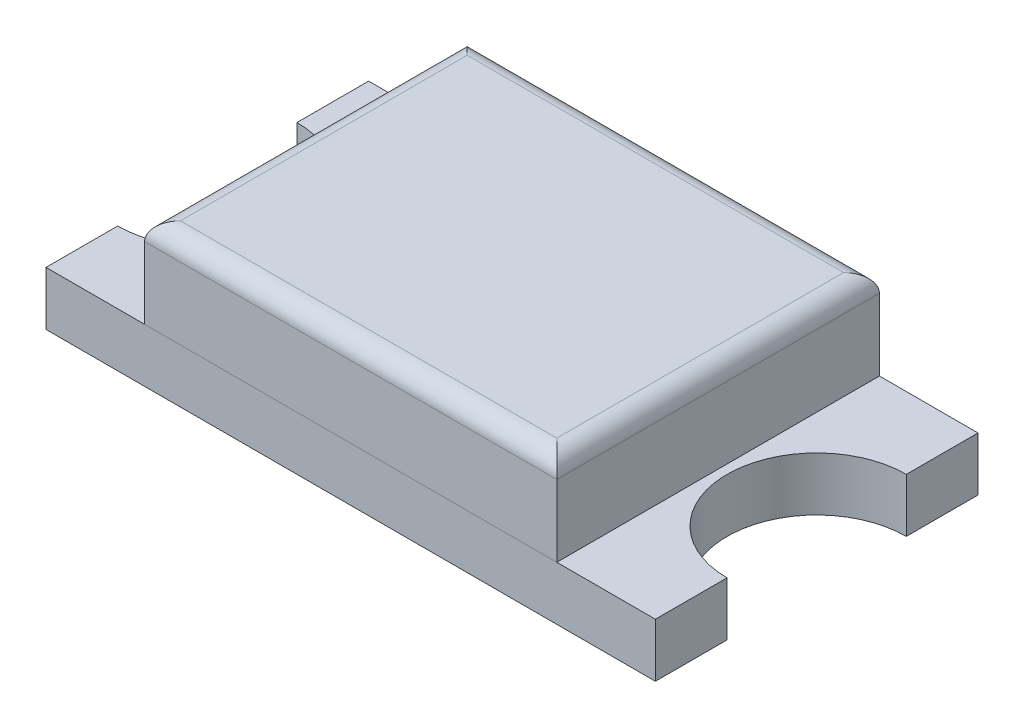
ISO-10303-21;
HEADER;
FILE_DESCRIPTION(('STEP AP214'),'2;1');
FILE_NAME('part.step','',(''),(''),'','','');
FILE_SCHEMA(('AUTOMOTIVE_DESIGN { 1 0 10303 214 1 1 1 1 }'));
ENDSEC;
DATA;
#1=APPLICATION_CONTEXT('core data for automotive mechanical design processes');
#2=APPLICATION_PROTOCOL_DEFINITION('international standard','automotive_design',2000,#1);
#3=PRODUCT_CONTEXT('',#1,'mechanical');
#4=PRODUCT('Part','Part','',(#3));
#5=PRODUCT_RELATED_PRODUCT_CATEGORY('part','',(#4));
#6=PRODUCT_DEFINITION_FORMATION('','',#4);
#7=PRODUCT_DEFINITION_CONTEXT('part definition',#1,'design');
#8=PRODUCT_DEFINITION('design','',#6,#7);
#9=PRODUCT_DEFINITION_SHAPE('','',#8);
#10=(LENGTH_UNIT() NAMED_UNIT(*) SI_UNIT(.MILLI.,.METRE.));
#11=(NAMED_UNIT(*) PLANE_ANGLE_UNIT() SI_UNIT($,.RADIAN.));
#12=(NAMED_UNIT(*) SI_UNIT($,.STERADIAN.) SOLID_ANGLE_UNIT());
#13=UNCERTAINTY_MEASURE_WITH_UNIT(LENGTH_MEASURE(1.E-05),#10,'distance_accuracy_value','');
#14=(GEOMETRIC_REPRESENTATION_CONTEXT(3) GLOBAL_UNCERTAINTY_ASSIGNED_CONTEXT((#13)) GLOBAL_UNIT_ASSIGNED_CONTEXT((#10,
#11,#12)) REPRESENTATION_CONTEXT('',''));
#15=CARTESIAN_POINT('',(0.,0.,0.));
#16=DIRECTION('',(0.,0.,1.));
#17=DIRECTION('',(1.,0.,0.));
#18=AXIS2_PLACEMENT_3D('',#15,#16,#17);
#19=CARTESIAN_POINT('',(-0.575,0.4,0.45));
#20=DIRECTION('',(1.,0.,0.));
#21=DIRECTION('',(0.,0.,-1.));
#22=AXIS2_PLACEMENT_3D('',#19,#20,#21);
#23=PLANE('',#22);
#24=DIRECTION('',(0.,-1.,0.));
#25=VECTOR('',#24,1.);
#26=CARTESIAN_POINT('',(-0.575,0.4,0.45));
#27=LINE('',#26,#25);
#28=CARTESIAN_POINT('',(-0.575,0.35,0.45));
#29=VERTEX_POINT('',#28);
#30=CARTESIAN_POINT('',(-0.575,0.15,0.45));
#31=VERTEX_POINT('',#30);
#32=EDGE_CURVE('E94',#29,#31,#27,.T.);
#33=ORIENTED_EDGE('',*,*,#32,.F.);
#34=DIRECTION('',(0.,0.,1.));
#35=VECTOR('',#34,1.);
#36=CARTESIAN_POINT('',(-0.575,0.35,0.45));
#37=LINE('',#36,#35);
#38=CARTESIAN_POINT('',(-0.575,0.35,-0.45));
#39=VERTEX_POINT('',#38);
#40=EDGE_CURVE('E51',#29,#39,#37,.F.);
#41=ORIENTED_EDGE('',*,*,#40,.T.);
#42=DIRECTION('',(0.,-1.,0.));
#43=VECTOR('',#42,1.);
#44=CARTESIAN_POINT('',(-0.575,0.4,-0.45));
#45=LINE('',#44,#43);
#46=CARTESIAN_POINT('',(-0.575,0.15,-0.45));
#47=VERTEX_POINT('',#46);
#48=EDGE_CURVE('E114',#39,#47,#45,.T.);
#49=ORIENTED_EDGE('',*,*,#48,.T.);
#50=DIRECTION('',(0.,0.,1.));
#51=VECTOR('',#50,1.);
#52=CARTESIAN_POINT('',(-0.575,0.15,0.45));
#53=LINE('',#52,#51);
#54=EDGE_CURVE('E109',#47,#31,#53,.T.);
#55=ORIENTED_EDGE('',*,*,#54,.T.);
#56=EDGE_LOOP('',(#33,#41,#49,#55));
#57=FACE_BOUND('',#56,.T.);
#58=ADVANCED_FACE('F42',(#57),#23,.F.);
#59=CARTESIAN_POINT('',(-0.575,0.4,0.45));
#60=DIRECTION('',(0.,0.,-1.));
#61=DIRECTION('',(-1.,0.,0.));
#62=AXIS2_PLACEMENT_3D('',#59,#60,#61);
#63=PLANE('',#62);
#64=DIRECTION('',(0.,-1.,0.));
#65=VECTOR('',#64,1.);
#66=CARTESIAN_POINT('',(0.575,0.4,0.45));
#67=LINE('',#66,#65);
#68=CARTESIAN_POINT('',(0.575,0.35,0.45));
#69=VERTEX_POINT('',#68);
#70=CARTESIAN_POINT('',(0.575,0.15,0.45));
#71=VERTEX_POINT('',#70);
#72=EDGE_CURVE('E103',#69,#71,#67,.T.);
#73=ORIENTED_EDGE('',*,*,#72,.F.);
#74=DIRECTION('',(1.,0.,0.));
#75=VECTOR('',#74,1.);
#76=CARTESIAN_POINT('',(-0.575,0.35,0.45));
#77=LINE('',#76,#75);
#78=EDGE_CURVE('E12',#69,#29,#77,.F.);
#79=ORIENTED_EDGE('',*,*,#78,.T.);
#80=ORIENTED_EDGE('',*,*,#32,.T.);
#81=DIRECTION('',(1.,0.,0.));
#82=VECTOR('',#81,1.);
#83=CARTESIAN_POINT('',(-0.575,0.15,0.45));
#84=LINE('',#83,#82);
#85=EDGE_CURVE('E97',#31,#71,#84,.T.);
#86=ORIENTED_EDGE('',*,*,#85,.T.);
#87=EDGE_LOOP('',(#73,#79,#80,#86));
#88=FACE_BOUND('',#87,.T.);
#89=ADVANCED_FACE('F96',(#88),#63,.F.);
#90=CARTESIAN_POINT('',(0.575,0.4,0.45));
#91=DIRECTION('',(-1.,0.,0.));
#92=DIRECTION('',(0.,0.,1.));
#93=AXIS2_PLACEMENT_3D('',#90,#91,#92);
#94=PLANE('',#93);
#95=DIRECTION('',(0.,-1.,0.));
#96=VECTOR('',#95,1.);
#97=CARTESIAN_POINT('',(0.575,0.4,-0.45));
#98=LINE('',#97,#96);
#99=CARTESIAN_POINT('',(0.575,0.35,-0.45));
#100=VERTEX_POINT('',#99);
#101=CARTESIAN_POINT('',(0.575,0.15,-0.45));
#102=VERTEX_POINT('',#101);
#103=EDGE_CURVE('E124',#100,#102,#98,.T.);
#104=ORIENTED_EDGE('',*,*,#103,.F.);
#105=DIRECTION('',(0.,0.,-1.));
#106=VECTOR('',#105,1.);
#107=CARTESIAN_POINT('',(0.575,0.35,0.45));
#108=LINE('',#107,#106);
#109=EDGE_CURVE('E65',#100,#69,#108,.F.);
#110=ORIENTED_EDGE('',*,*,#109,.T.);
#111=ORIENTED_EDGE('',*,*,#72,.T.);
#112=DIRECTION('',(0.,0.,-1.));
#113=VECTOR('',#112,1.);
#114=CARTESIAN_POINT('',(0.575,0.15,0.45));
#115=LINE('',#114,#113);
#116=EDGE_CURVE('E111',#71,#102,#115,.T.);
#117=ORIENTED_EDGE('',*,*,#116,.T.);
#118=EDGE_LOOP('',(#104,#110,#111,#117));
#119=FACE_BOUND('',#118,.T.);
#120=ADVANCED_FACE('F162',(#119),#94,.F.);
#121=CARTESIAN_POINT('',(-0.575,0.4,-0.45));
#122=DIRECTION('',(0.,0.,1.));
#123=DIRECTION('',(1.,0.,0.));
#124=AXIS2_PLACEMENT_3D('',#121,#122,#123);
#125=PLANE('',#124);
#126=ORIENTED_EDGE('',*,*,#48,.F.);
#127=DIRECTION('',(-1.,0.,0.));
#128=VECTOR('',#127,1.);
#129=CARTESIAN_POINT('',(-0.575,0.35,-0.45));
#130=LINE('',#129,#128);
#131=EDGE_CURVE('E135',#39,#100,#130,.F.);
#132=ORIENTED_EDGE('',*,*,#131,.T.);
#133=ORIENTED_EDGE('',*,*,#103,.T.);
#134=DIRECTION('',(-1.,0.,0.));
#135=VECTOR('',#134,1.);
#136=CARTESIAN_POINT('',(-0.575,0.15,-0.45));
#137=LINE('',#136,#135);
#138=EDGE_CURVE('E121',#102,#47,#137,.T.);
#139=ORIENTED_EDGE('',*,*,#138,.T.);
#140=EDGE_LOOP('',(#126,#132,#133,#139));
#141=FACE_BOUND('',#140,.T.);
#142=ADVANCED_FACE('F161',(#141),#125,.F.);
#143=CARTESIAN_POINT('',(-0.575,0.4,-0.45));
#144=DIRECTION('',(0.,-1.,0.));
#145=DIRECTION('',(0.,0.,-1.));
#146=AXIS2_PLACEMENT_3D('',#143,#144,#145);
#147=PLANE('',#146);
#148=DIRECTION('',(0.,0.,-1.));
#149=VECTOR('',#148,1.);
#150=CARTESIAN_POINT('',(0.525,0.4,-0.45));
#151=LINE('',#150,#149);
#152=CARTESIAN_POINT('',(0.525,0.4,0.4));
#153=VERTEX_POINT('',#152);
#154=CARTESIAN_POINT('',(0.525,0.4,-0.4));
#155=VERTEX_POINT('',#154);
#156=EDGE_CURVE('E130',#153,#155,#151,.T.);
#157=ORIENTED_EDGE('',*,*,#156,.T.);
#158=DIRECTION('',(-1.,0.,0.));
#159=VECTOR('',#158,1.);
#160=CARTESIAN_POINT('',(-0.575,0.4,-0.4));
#161=LINE('',#160,#159);
#162=CARTESIAN_POINT('',(-0.525,0.4,-0.4));
#163=VERTEX_POINT('',#162);
#164=EDGE_CURVE('E132',#155,#163,#161,.T.);
#165=ORIENTED_EDGE('',*,*,#164,.T.);
#166=DIRECTION('',(0.,0.,1.));
#167=VECTOR('',#166,1.);
#168=CARTESIAN_POINT('',(-0.525,0.4,-0.45));
#169=LINE('',#168,#167);
#170=CARTESIAN_POINT('',(-0.525,0.4,0.4));
#171=VERTEX_POINT('',#170);
#172=EDGE_CURVE('E128',#163,#171,#169,.T.);
#173=ORIENTED_EDGE('',*,*,#172,.T.);
#174=DIRECTION('',(1.,0.,0.));
#175=VECTOR('',#174,1.);
#176=CARTESIAN_POINT('',(-0.575,0.4,0.4));
#177=LINE('',#176,#175);
#178=EDGE_CURVE('E102',#171,#153,#177,.T.);
#179=ORIENTED_EDGE('',*,*,#178,.T.);
#180=EDGE_LOOP('',(#157,#165,#173,#179));
#181=FACE_BOUND('',#180,.T.);
#182=ADVANCED_FACE('F154',(#181),#147,.F.);
#183=CARTESIAN_POINT('',(-0.575,0.15,-0.45));
#184=DIRECTION('',(0.,-1.,0.));
#185=DIRECTION('',(0.,0.,-1.));
#186=AXIS2_PLACEMENT_3D('',#183,#184,#185);
#187=PLANE('',#186);
#188=ORIENTED_EDGE('',*,*,#54,.F.);
#189=ORIENTED_EDGE('',*,*,#138,.F.);
#190=ORIENTED_EDGE('',*,*,#116,.F.);
#191=ORIENTED_EDGE('',*,*,#85,.F.);
#192=EDGE_LOOP('',(#188,#189,#190,#191));
#193=FACE_BOUND('',#192,.T.);
#194=ADVANCED_FACE('F107',(#193),#187,.T.);
#195=CARTESIAN_POINT('',(-0.575,0.35,0.4));
#196=DIRECTION('',(1.,0.,0.));
#197=DIRECTION('',(0.,0.,-1.));
#198=AXIS2_PLACEMENT_3D('',#195,#196,#197);
#199=CYLINDRICAL_SURFACE('',#198,0.05);
#200=CARTESIAN_POINT('',(-0.525,0.35,0.4));
#201=DIRECTION('',(0.707106781186547,0.,0.707106781186547));
#202=DIRECTION('',(0.707106781186547,0.,-0.707106781186547));
#203=AXIS2_PLACEMENT_3D('',#200,#201,#202);
#204=ELLIPSE('',#203,0.0707106781186548,0.05);
#205=EDGE_CURVE('E118',#29,#171,#204,.F.);
#206=ORIENTED_EDGE('',*,*,#205,.F.);
#207=ORIENTED_EDGE('',*,*,#78,.F.);
#208=CARTESIAN_POINT('',(0.525,0.35,0.4));
#209=DIRECTION('',(0.707106781186547,0.,-0.707106781186547));
#210=DIRECTION('',(0.707106781186547,0.,0.707106781186547));
#211=AXIS2_PLACEMENT_3D('',#208,#209,#210);
#212=ELLIPSE('',#211,0.0707106781186548,0.05);
#213=EDGE_CURVE('E46',#153,#69,#212,.T.);
#214=ORIENTED_EDGE('',*,*,#213,.F.);
#215=ORIENTED_EDGE('',*,*,#178,.F.);
#216=EDGE_LOOP('',(#206,#207,#214,#215));
#217=FACE_BOUND('',#216,.T.);
#218=ADVANCED_FACE('F44',(#217),#199,.T.);
#219=CARTESIAN_POINT('',(0.525,0.35,-0.45));
#220=DIRECTION('',(0.,0.,-1.));
#221=DIRECTION('',(-1.,0.,0.));
#222=AXIS2_PLACEMENT_3D('',#219,#220,#221);
#223=CYLINDRICAL_SURFACE('',#222,0.05);
#224=ORIENTED_EDGE('',*,*,#213,.T.);
#225=ORIENTED_EDGE('',*,*,#109,.F.);
#226=CARTESIAN_POINT('',(0.525,0.35,-0.4));
#227=DIRECTION('',(-0.707106781186547,0.,-0.707106781186547));
#228=DIRECTION('',(0.707106781186547,0.,-0.707106781186547));
#229=AXIS2_PLACEMENT_3D('',#226,#227,#228);
#230=ELLIPSE('',#229,0.0707106781186548,0.05);
#231=EDGE_CURVE('E142',#155,#100,#230,.T.);
#232=ORIENTED_EDGE('',*,*,#231,.F.);
#233=ORIENTED_EDGE('',*,*,#156,.F.);
#234=EDGE_LOOP('',(#224,#225,#232,#233));
#235=FACE_BOUND('',#234,.T.);
#236=ADVANCED_FACE('F179',(#235),#223,.T.);
#237=CARTESIAN_POINT('',(-0.525,0.35,-0.45));
#238=DIRECTION('',(0.,0.,1.));
#239=DIRECTION('',(1.,0.,0.));
#240=AXIS2_PLACEMENT_3D('',#237,#238,#239);
#241=CYLINDRICAL_SURFACE('',#240,0.05);
#242=ORIENTED_EDGE('',*,*,#205,.T.);
#243=ORIENTED_EDGE('',*,*,#172,.F.);
#244=CARTESIAN_POINT('',(-0.525,0.35,-0.4));
#245=DIRECTION('',(-0.707106781186547,0.,0.707106781186547));
#246=DIRECTION('',(0.707106781186547,0.,0.707106781186547));
#247=AXIS2_PLACEMENT_3D('',#244,#245,#246);
#248=ELLIPSE('',#247,0.0707106781186548,0.05);
#249=EDGE_CURVE('E140',#39,#163,#248,.F.);
#250=ORIENTED_EDGE('',*,*,#249,.F.);
#251=ORIENTED_EDGE('',*,*,#40,.F.);
#252=EDGE_LOOP('',(#242,#243,#250,#251));
#253=FACE_BOUND('',#252,.T.);
#254=ADVANCED_FACE('F147',(#253),#241,.T.);
#255=CARTESIAN_POINT('',(-0.575,0.35,-0.4));
#256=DIRECTION('',(-1.,0.,0.));
#257=DIRECTION('',(0.,0.,1.));
#258=AXIS2_PLACEMENT_3D('',#255,#256,#257);
#259=CYLINDRICAL_SURFACE('',#258,0.05);
#260=ORIENTED_EDGE('',*,*,#231,.T.);
#261=ORIENTED_EDGE('',*,*,#131,.F.);
#262=ORIENTED_EDGE('',*,*,#249,.T.);
#263=ORIENTED_EDGE('',*,*,#164,.F.);
#264=EDGE_LOOP('',(#260,#261,#262,#263));
#265=FACE_BOUND('',#264,.T.);
#266=ADVANCED_FACE('F158',(#265),#259,.T.);
#267=CLOSED_SHELL('',(#58,#89,#120,#142,#182,#194,#218,#236,#254,#266));
#268=MANIFOLD_SOLID_BREP('B2',#267);
#269=CARTESIAN_POINT('',(0.85,0.15,0.));
#270=DIRECTION('',(0.,-1.,0.));
#271=DIRECTION('',(0.,0.,-1.));
#272=AXIS2_PLACEMENT_3D('',#269,#270,#271);
#273=CYLINDRICAL_SURFACE('',#272,0.25);
#274=CARTESIAN_POINT('',(0.85,0.,0.));
#275=DIRECTION('',(0.,-1.,0.));
#276=DIRECTION('',(0.,0.,1.));
#277=AXIS2_PLACEMENT_3D('',#274,#275,#276);
#278=CIRCLE('',#277,0.25);
#279=CARTESIAN_POINT('',(0.85,0.,0.25));
#280=VERTEX_POINT('',#279);
#281=CARTESIAN_POINT('',(0.85,0.,-0.25));
#282=VERTEX_POINT('',#281);
#283=EDGE_CURVE('E341',#280,#282,#278,.T.);
#284=ORIENTED_EDGE('',*,*,#283,.T.);
#285=DIRECTION('',(0.,-1.,0.));
#286=VECTOR('',#285,1.);
#287=CARTESIAN_POINT('',(0.85,0.15,-0.25));
#288=LINE('',#287,#286);
#289=CARTESIAN_POINT('',(0.85,0.15,-0.25));
#290=VERTEX_POINT('',#289);
#291=EDGE_CURVE('E40',#290,#282,#288,.T.);
#292=ORIENTED_EDGE('',*,*,#291,.F.);
#293=CARTESIAN_POINT('',(0.85,0.15,0.));
#294=DIRECTION('',(0.,-1.,0.));
#295=DIRECTION('',(0.,0.,1.));
#296=AXIS2_PLACEMENT_3D('',#293,#294,#295);
#297=CIRCLE('',#296,0.25);
#298=CARTESIAN_POINT('',(0.85,0.15,0.25));
#299=VERTEX_POINT('',#298);
#300=EDGE_CURVE('E355',#299,#290,#297,.T.);
#301=ORIENTED_EDGE('',*,*,#300,.F.);
#302=DIRECTION('',(0.,-1.,0.));
#303=VECTOR('',#302,1.);
#304=CARTESIAN_POINT('',(0.85,0.15,0.25));
#305=LINE('',#304,#303);
#306=EDGE_CURVE('E337',#299,#280,#305,.T.);
#307=ORIENTED_EDGE('',*,*,#306,.T.);
#308=EDGE_LOOP('',(#284,#292,#301,#307));
#309=FACE_BOUND('',#308,.T.);
#310=ADVANCED_FACE('F245',(#309),#273,.F.);
#311=CARTESIAN_POINT('',(0.85,0.15,-0.25));
#312=DIRECTION('',(-1.,0.,0.));
#313=DIRECTION('',(0.,0.,1.));
#314=AXIS2_PLACEMENT_3D('',#311,#312,#313);
#315=PLANE('',#314);
#316=DIRECTION('',(0.,0.,-1.));
#317=VECTOR('',#316,1.);
#318=CARTESIAN_POINT('',(0.85,0.,-0.25));
#319=LINE('',#318,#317);
#320=CARTESIAN_POINT('',(0.85,0.,-0.45));
#321=VERTEX_POINT('',#320);
#322=EDGE_CURVE('E344',#282,#321,#319,.T.);
#323=ORIENTED_EDGE('',*,*,#322,.T.);
#324=DIRECTION('',(0.,-1.,0.));
#325=VECTOR('',#324,1.);
#326=CARTESIAN_POINT('',(0.85,0.15,-0.45));
#327=LINE('',#326,#325);
#328=CARTESIAN_POINT('',(0.85,0.15,-0.45));
#329=VERTEX_POINT('',#328);
#330=EDGE_CURVE('E253',#329,#321,#327,.T.);
#331=ORIENTED_EDGE('',*,*,#330,.F.);
#332=DIRECTION('',(0.,0.,-1.));
#333=VECTOR('',#332,1.);
#334=CARTESIAN_POINT('',(0.85,0.15,-0.25));
#335=LINE('',#334,#333);
#336=EDGE_CURVE('E304',#290,#329,#335,.T.);
#337=ORIENTED_EDGE('',*,*,#336,.F.);
#338=ORIENTED_EDGE('',*,*,#291,.T.);
#339=EDGE_LOOP('',(#323,#331,#337,#338));
#340=FACE_BOUND('',#339,.T.);
#341=ADVANCED_FACE('F390',(#340),#315,.F.);
#342=CARTESIAN_POINT('',(-0.85,0.15,-0.45));
#343=DIRECTION('',(0.,0.,1.));
#344=DIRECTION('',(1.,0.,0.));
#345=AXIS2_PLACEMENT_3D('',#342,#343,#344);
#346=PLANE('',#345);
#347=DIRECTION('',(-1.,0.,0.));
#348=VECTOR('',#347,1.);
#349=CARTESIAN_POINT('',(-0.85,0.,-0.45));
#350=LINE('',#349,#348);
#351=CARTESIAN_POINT('',(-0.85,0.,-0.45));
#352=VERTEX_POINT('',#351);
#353=EDGE_CURVE('E346',#321,#352,#350,.T.);
#354=ORIENTED_EDGE('',*,*,#353,.T.);
#355=DIRECTION('',(0.,-1.,0.));
#356=VECTOR('',#355,1.);
#357=CARTESIAN_POINT('',(-0.85,0.15,-0.45));
#358=LINE('',#357,#356);
#359=CARTESIAN_POINT('',(-0.85,0.15,-0.45));
#360=VERTEX_POINT('',#359);
#361=EDGE_CURVE('E362',#360,#352,#358,.T.);
#362=ORIENTED_EDGE('',*,*,#361,.F.);
#363=DIRECTION('',(-1.,0.,0.));
#364=VECTOR('',#363,1.);
#365=CARTESIAN_POINT('',(-0.85,0.15,-0.45));
#366=LINE('',#365,#364);
#367=EDGE_CURVE('E370',#329,#360,#366,.T.);
#368=ORIENTED_EDGE('',*,*,#367,.F.);
#369=ORIENTED_EDGE('',*,*,#330,.T.);
#370=EDGE_LOOP('',(#354,#362,#368,#369));
#371=FACE_BOUND('',#370,.T.);
#372=ADVANCED_FACE('F368',(#371),#346,.F.);
#373=CARTESIAN_POINT('',(-0.85,0.15,-0.25));
#374=DIRECTION('',(1.,0.,0.));
#375=DIRECTION('',(0.,0.,-1.));
#376=AXIS2_PLACEMENT_3D('',#373,#374,#375);
#377=PLANE('',#376);
#378=DIRECTION('',(0.,0.,1.));
#379=VECTOR('',#378,1.);
#380=CARTESIAN_POINT('',(-0.85,0.,-0.25));
#381=LINE('',#380,#379);
#382=CARTESIAN_POINT('',(-0.85,0.,-0.25));
#383=VERTEX_POINT('',#382);
#384=EDGE_CURVE('E348',#352,#383,#381,.T.);
#385=ORIENTED_EDGE('',*,*,#384,.T.);
#386=DIRECTION('',(0.,-1.,0.));
#387=VECTOR('',#386,1.);
#388=CARTESIAN_POINT('',(-0.85,0.15,-0.25));
#389=LINE('',#388,#387);
#390=CARTESIAN_POINT('',(-0.85,0.15,-0.25));
#391=VERTEX_POINT('',#390);
#392=EDGE_CURVE('E359',#391,#383,#389,.T.);
#393=ORIENTED_EDGE('',*,*,#392,.F.);
#394=DIRECTION('',(0.,0.,1.));
#395=VECTOR('',#394,1.);
#396=CARTESIAN_POINT('',(-0.85,0.15,-0.25));
#397=LINE('',#396,#395);
#398=EDGE_CURVE('E382',#360,#391,#397,.T.);
#399=ORIENTED_EDGE('',*,*,#398,.F.);
#400=ORIENTED_EDGE('',*,*,#361,.T.);
#401=EDGE_LOOP('',(#385,#393,#399,#400));
#402=FACE_BOUND('',#401,.T.);
#403=ADVANCED_FACE('F378',(#402),#377,.F.);
#404=CARTESIAN_POINT('',(-0.85,0.15,0.));
#405=DIRECTION('',(0.,-1.,0.));
#406=DIRECTION('',(0.,0.,-1.));
#407=AXIS2_PLACEMENT_3D('',#404,#405,#406);
#408=CYLINDRICAL_SURFACE('',#407,0.25);
#409=CARTESIAN_POINT('',(-0.85,0.,0.));
#410=DIRECTION('',(0.,-1.,0.));
#411=DIRECTION('',(0.,0.,1.));
#412=AXIS2_PLACEMENT_3D('',#409,#410,#411);
#413=CIRCLE('',#412,0.25);
#414=CARTESIAN_POINT('',(-0.85,0.,0.25));
#415=VERTEX_POINT('',#414);
#416=EDGE_CURVE('E350',#383,#415,#413,.T.);
#417=ORIENTED_EDGE('',*,*,#416,.T.);
#418=DIRECTION('',(0.,-1.,0.));
#419=VECTOR('',#418,1.);
#420=CARTESIAN_POINT('',(-0.85,0.15,0.25));
#421=LINE('',#420,#419);
#422=CARTESIAN_POINT('',(-0.85,0.15,0.25));
#423=VERTEX_POINT('',#422);
#424=EDGE_CURVE('E332',#423,#415,#421,.T.);
#425=ORIENTED_EDGE('',*,*,#424,.F.);
#426=CARTESIAN_POINT('',(-0.85,0.15,0.));
#427=DIRECTION('',(0.,-1.,0.));
#428=DIRECTION('',(0.,0.,1.));
#429=AXIS2_PLACEMENT_3D('',#426,#427,#428);
#430=CIRCLE('',#429,0.25);
#431=EDGE_CURVE('E323',#391,#423,#430,.T.);
#432=ORIENTED_EDGE('',*,*,#431,.F.);
#433=ORIENTED_EDGE('',*,*,#392,.T.);
#434=EDGE_LOOP('',(#417,#425,#432,#433));
#435=FACE_BOUND('',#434,.T.);
#436=ADVANCED_FACE('F381',(#435),#408,.F.);
#437=CARTESIAN_POINT('',(-0.85,0.15,0.45));
#438=DIRECTION('',(1.,0.,0.));
#439=DIRECTION('',(0.,0.,-1.));
#440=AXIS2_PLACEMENT_3D('',#437,#438,#439);
#441=PLANE('',#440);
#442=DIRECTION('',(0.,0.,1.));
#443=VECTOR('',#442,1.);
#444=CARTESIAN_POINT('',(-0.85,0.,0.45));
#445=LINE('',#444,#443);
#446=CARTESIAN_POINT('',(-0.85,0.,0.45));
#447=VERTEX_POINT('',#446);
#448=EDGE_CURVE('E331',#415,#447,#445,.T.);
#449=ORIENTED_EDGE('',*,*,#448,.T.);
#450=DIRECTION('',(0.,-1.,0.));
#451=VECTOR('',#450,1.);
#452=CARTESIAN_POINT('',(-0.85,0.15,0.45));
#453=LINE('',#452,#451);
#454=CARTESIAN_POINT('',(-0.85,0.15,0.45));
#455=VERTEX_POINT('',#454);
#456=EDGE_CURVE('E328',#455,#447,#453,.T.);
#457=ORIENTED_EDGE('',*,*,#456,.F.);
#458=DIRECTION('',(0.,0.,1.));
#459=VECTOR('',#458,1.);
#460=CARTESIAN_POINT('',(-0.85,0.15,0.45));
#461=LINE('',#460,#459);
#462=EDGE_CURVE('E317',#423,#455,#461,.T.);
#463=ORIENTED_EDGE('',*,*,#462,.F.);
#464=ORIENTED_EDGE('',*,*,#424,.T.);
#465=EDGE_LOOP('',(#449,#457,#463,#464));
#466=FACE_BOUND('',#465,.T.);
#467=ADVANCED_FACE('F329',(#466),#441,.F.);
#468=CARTESIAN_POINT('',(-0.85,0.15,0.45));
#469=DIRECTION('',(0.,0.,-1.));
#470=DIRECTION('',(-1.,0.,0.));
#471=AXIS2_PLACEMENT_3D('',#468,#469,#470);
#472=PLANE('',#471);
#473=DIRECTION('',(1.,0.,0.));
#474=VECTOR('',#473,1.);
#475=CARTESIAN_POINT('',(-0.85,0.,0.45));
#476=LINE('',#475,#474);
#477=CARTESIAN_POINT('',(0.85,0.,0.45));
#478=VERTEX_POINT('',#477);
#479=EDGE_CURVE('E290',#447,#478,#476,.T.);
#480=ORIENTED_EDGE('',*,*,#479,.T.);
#481=DIRECTION('',(0.,-1.,0.));
#482=VECTOR('',#481,1.);
#483=CARTESIAN_POINT('',(0.85,0.15,0.45));
#484=LINE('',#483,#482);
#485=CARTESIAN_POINT('',(0.85,0.15,0.45));
#486=VERTEX_POINT('',#485);
#487=EDGE_CURVE('E333',#486,#478,#484,.T.);
#488=ORIENTED_EDGE('',*,*,#487,.F.);
#489=DIRECTION('',(1.,0.,0.));
#490=VECTOR('',#489,1.);
#491=CARTESIAN_POINT('',(-0.85,0.15,0.45));
#492=LINE('',#491,#490);
#493=EDGE_CURVE('E321',#455,#486,#492,.T.);
#494=ORIENTED_EDGE('',*,*,#493,.F.);
#495=ORIENTED_EDGE('',*,*,#456,.T.);
#496=EDGE_LOOP('',(#480,#488,#494,#495));
#497=FACE_BOUND('',#496,.T.);
#498=ADVANCED_FACE('F335',(#497),#472,.F.);
#499=CARTESIAN_POINT('',(0.85,0.15,0.45));
#500=DIRECTION('',(-1.,0.,0.));
#501=DIRECTION('',(0.,0.,1.));
#502=AXIS2_PLACEMENT_3D('',#499,#500,#501);
#503=PLANE('',#502);
#504=DIRECTION('',(0.,0.,-1.));
#505=VECTOR('',#504,1.);
#506=CARTESIAN_POINT('',(0.85,0.,0.45));
#507=LINE('',#506,#505);
#508=EDGE_CURVE('E296',#478,#280,#507,.T.);
#509=ORIENTED_EDGE('',*,*,#508,.T.);
#510=ORIENTED_EDGE('',*,*,#306,.F.);
#511=DIRECTION('',(0.,0.,-1.));
#512=VECTOR('',#511,1.);
#513=CARTESIAN_POINT('',(0.85,0.15,0.45));
#514=LINE('',#513,#512);
#515=EDGE_CURVE('E261',#486,#299,#514,.T.);
#516=ORIENTED_EDGE('',*,*,#515,.F.);
#517=ORIENTED_EDGE('',*,*,#487,.T.);
#518=EDGE_LOOP('',(#509,#510,#516,#517));
#519=FACE_BOUND('',#518,.T.);
#520=ADVANCED_FACE('F406',(#519),#503,.F.);
#521=CARTESIAN_POINT('',(0.85,0.15,0.));
#522=DIRECTION('',(0.,1.,0.));
#523=DIRECTION('',(0.,0.,1.));
#524=AXIS2_PLACEMENT_3D('',#521,#522,#523);
#525=PLANE('',#524);
#526=ORIENTED_EDGE('',*,*,#300,.T.);
#527=ORIENTED_EDGE('',*,*,#336,.T.);
#528=ORIENTED_EDGE('',*,*,#367,.T.);
#529=ORIENTED_EDGE('',*,*,#398,.T.);
#530=ORIENTED_EDGE('',*,*,#431,.T.);
#531=ORIENTED_EDGE('',*,*,#462,.T.);
#532=ORIENTED_EDGE('',*,*,#493,.T.);
#533=ORIENTED_EDGE('',*,*,#515,.T.);
#534=EDGE_LOOP('',(#526,#527,#528,#529,#530,#531,#532,#533));
#535=FACE_BOUND('',#534,.T.);
#536=ADVANCED_FACE('F319',(#535),#525,.T.);
#537=CARTESIAN_POINT('',(0.85,0.,0.));
#538=DIRECTION('',(0.,1.,0.));
#539=DIRECTION('',(0.,0.,1.));
#540=AXIS2_PLACEMENT_3D('',#537,#538,#539);
#541=PLANE('',#540);
#542=ORIENTED_EDGE('',*,*,#283,.F.);
#543=ORIENTED_EDGE('',*,*,#508,.F.);
#544=ORIENTED_EDGE('',*,*,#479,.F.);
#545=ORIENTED_EDGE('',*,*,#448,.F.);
#546=ORIENTED_EDGE('',*,*,#416,.F.);
#547=ORIENTED_EDGE('',*,*,#384,.F.);
#548=ORIENTED_EDGE('',*,*,#353,.F.);
#549=ORIENTED_EDGE('',*,*,#322,.F.);
#550=EDGE_LOOP('',(#542,#543,#544,#545,#546,#547,#548,#549));
#551=FACE_BOUND('',#550,.T.);
#552=ADVANCED_FACE('F374',(#551),#541,.F.);
#553=CLOSED_SHELL('',(#310,#341,#372,#403,#436,#467,#498,#520,#536,#552));
#554=MANIFOLD_SOLID_BREP('B6',#553);
#555=ADVANCED_BREP_SHAPE_REPRESENTATION('',(#18,#268,#554),#14);
#556=SHAPE_DEFINITION_REPRESENTATION(#9,#555);
ENDSEC;
END-ISO-10303-21;
